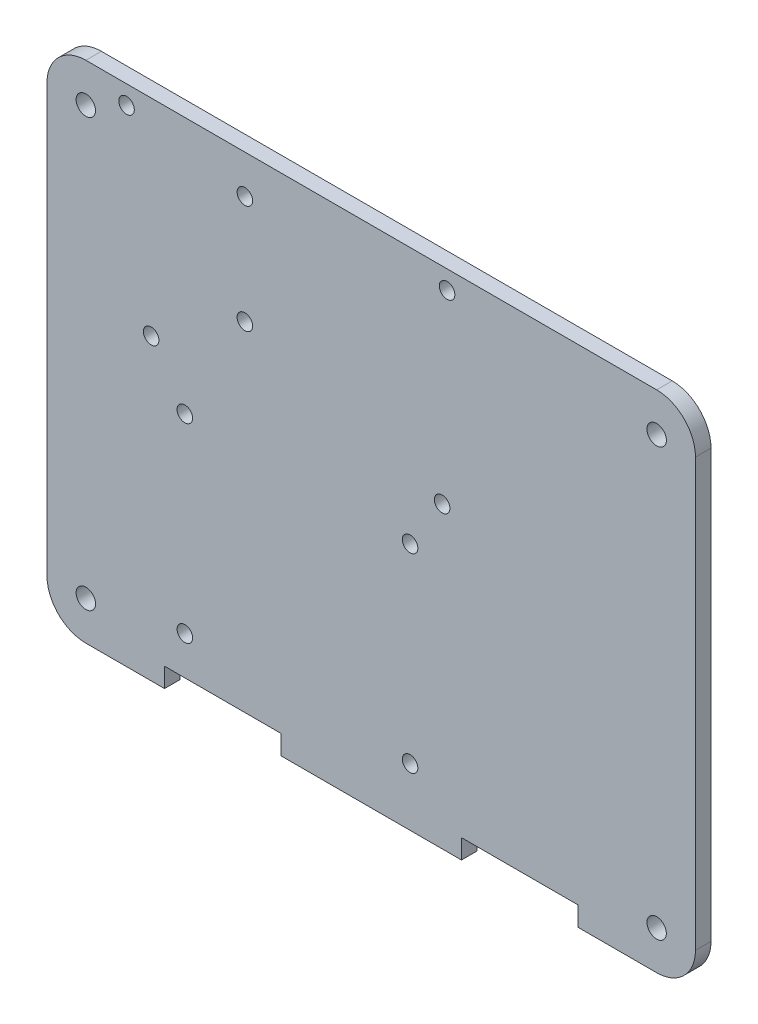
ISO-10303-21;
HEADER;
FILE_DESCRIPTION(('STEP AP214'),'2;1');
FILE_NAME('part.step','',(''),(''),'','','');
FILE_SCHEMA(('AUTOMOTIVE_DESIGN { 1 0 10303 214 1 1 1 1 }'));
ENDSEC;
DATA;
#1=APPLICATION_CONTEXT('core data for automotive mechanical design processes');
#2=APPLICATION_PROTOCOL_DEFINITION('international standard','automotive_design',2000,#1);
#3=PRODUCT_CONTEXT('',#1,'mechanical');
#4=PRODUCT('Part','Part','',(#3));
#5=PRODUCT_RELATED_PRODUCT_CATEGORY('part','',(#4));
#6=PRODUCT_DEFINITION_FORMATION('','',#4);
#7=PRODUCT_DEFINITION_CONTEXT('part definition',#1,'design');
#8=PRODUCT_DEFINITION('design','',#6,#7);
#9=PRODUCT_DEFINITION_SHAPE('','',#8);
#10=(LENGTH_UNIT() NAMED_UNIT(*) SI_UNIT(.MILLI.,.METRE.));
#11=(NAMED_UNIT(*) PLANE_ANGLE_UNIT() SI_UNIT($,.RADIAN.));
#12=(NAMED_UNIT(*) SI_UNIT($,.STERADIAN.) SOLID_ANGLE_UNIT());
#13=UNCERTAINTY_MEASURE_WITH_UNIT(LENGTH_MEASURE(1.E-05),#10,'distance_accuracy_value','');
#14=(GEOMETRIC_REPRESENTATION_CONTEXT(3) GLOBAL_UNCERTAINTY_ASSIGNED_CONTEXT((#13)) GLOBAL_UNIT_ASSIGNED_CONTEXT((#10,
#11,#12)) REPRESENTATION_CONTEXT('',''));
#15=CARTESIAN_POINT('',(0.,0.,0.));
#16=DIRECTION('',(0.,0.,1.));
#17=DIRECTION('',(1.,0.,0.));
#18=AXIS2_PLACEMENT_3D('',#15,#16,#17);
#19=CARTESIAN_POINT('',(-83.5,-65.,4.));
#20=DIRECTION('',(0.,1.,0.));
#21=DIRECTION('',(0.,0.,1.));
#22=AXIS2_PLACEMENT_3D('',#19,#20,#21);
#23=PLANE('',#22);
#24=DIRECTION('',(1.,0.,0.));
#25=VECTOR('',#24,1.);
#26=CARTESIAN_POINT('',(-83.5,-65.,0.));
#27=LINE('',#26,#25);
#28=CARTESIAN_POINT('',(-73.5,-65.,0.));
#29=VERTEX_POINT('',#28);
#30=CARTESIAN_POINT('',(-53.2337974141173,-65.,0.));
#31=VERTEX_POINT('',#30);
#32=EDGE_CURVE('E165',#29,#31,#27,.T.);
#33=ORIENTED_EDGE('',*,*,#32,.T.);
#34=DIRECTION('',(0.,0.,1.));
#35=VECTOR('',#34,1.);
#36=CARTESIAN_POINT('',(-53.2337974141173,-65.,-6.));
#37=LINE('',#36,#35);
#38=CARTESIAN_POINT('',(-53.2337974141173,-65.,4.));
#39=VERTEX_POINT('',#38);
#40=EDGE_CURVE('E148',#31,#39,#37,.T.);
#41=ORIENTED_EDGE('',*,*,#40,.T.);
#42=DIRECTION('',(1.,0.,0.));
#43=VECTOR('',#42,1.);
#44=CARTESIAN_POINT('',(-83.5,-65.,4.));
#45=LINE('',#44,#43);
#46=CARTESIAN_POINT('',(-73.5,-65.,4.));
#47=VERTEX_POINT('',#46);
#48=EDGE_CURVE('E162',#47,#39,#45,.T.);
#49=ORIENTED_EDGE('',*,*,#48,.F.);
#50=DIRECTION('',(0.,0.,-1.));
#51=VECTOR('',#50,1.);
#52=CARTESIAN_POINT('',(-73.5,-65.,4.));
#53=LINE('',#52,#51);
#54=EDGE_CURVE('E174',#47,#29,#53,.T.);
#55=ORIENTED_EDGE('',*,*,#54,.T.);
#56=EDGE_LOOP('',(#33,#41,#49,#55));
#57=FACE_BOUND('',#56,.T.);
#58=ADVANCED_FACE('F33',(#57),#23,.F.);
#59=CARTESIAN_POINT('',(53.2337974141174,-65.,4.));
#60=VERTEX_POINT('',#59);
#61=CARTESIAN_POINT('',(73.5,-65.,4.));
#62=VERTEX_POINT('',#61);
#63=EDGE_CURVE('E177',#60,#62,#45,.T.);
#64=ORIENTED_EDGE('',*,*,#63,.F.);
#65=DIRECTION('',(0.,0.,1.));
#66=VECTOR('',#65,1.);
#67=CARTESIAN_POINT('',(53.2337974141174,-65.,-6.));
#68=LINE('',#67,#66);
#69=CARTESIAN_POINT('',(53.2337974141174,-65.,0.));
#70=VERTEX_POINT('',#69);
#71=EDGE_CURVE('E156',#70,#60,#68,.T.);
#72=ORIENTED_EDGE('',*,*,#71,.F.);
#73=CARTESIAN_POINT('',(73.5,-65.,0.));
#74=VERTEX_POINT('',#73);
#75=EDGE_CURVE('E425',#70,#74,#27,.T.);
#76=ORIENTED_EDGE('',*,*,#75,.T.);
#77=DIRECTION('',(0.,0.,-1.));
#78=VECTOR('',#77,1.);
#79=CARTESIAN_POINT('',(73.5000000000001,-65.,4.));
#80=LINE('',#79,#78);
#81=EDGE_CURVE('E396',#74,#62,#80,.F.);
#82=ORIENTED_EDGE('',*,*,#81,.T.);
#83=EDGE_LOOP('',(#64,#72,#76,#82));
#84=FACE_BOUND('',#83,.T.);
#85=ADVANCED_FACE('F338',(#84),#23,.F.);
#86=CARTESIAN_POINT('',(83.5,65.,4.));
#87=DIRECTION('',(-1.,0.,0.));
#88=DIRECTION('',(0.,-1.,0.));
#89=AXIS2_PLACEMENT_3D('',#86,#87,#88);
#90=PLANE('',#89);
#91=DIRECTION('',(0.,1.,0.));
#92=VECTOR('',#91,1.);
#93=CARTESIAN_POINT('',(83.5,65.,4.));
#94=LINE('',#93,#92);
#95=CARTESIAN_POINT('',(83.5,-55.,4.));
#96=VERTEX_POINT('',#95);
#97=CARTESIAN_POINT('',(83.5,55.,4.));
#98=VERTEX_POINT('',#97);
#99=EDGE_CURVE('E189',#96,#98,#94,.T.);
#100=ORIENTED_EDGE('',*,*,#99,.F.);
#101=DIRECTION('',(0.,0.,-1.));
#102=VECTOR('',#101,1.);
#103=CARTESIAN_POINT('',(83.5,-55.,4.));
#104=LINE('',#103,#102);
#105=CARTESIAN_POINT('',(83.5,-55.,0.));
#106=VERTEX_POINT('',#105);
#107=EDGE_CURVE('E403',#96,#106,#104,.T.);
#108=ORIENTED_EDGE('',*,*,#107,.T.);
#109=DIRECTION('',(0.,1.,0.));
#110=VECTOR('',#109,1.);
#111=CARTESIAN_POINT('',(83.5,65.,0.));
#112=LINE('',#111,#110);
#113=CARTESIAN_POINT('',(83.5,55.,0.));
#114=VERTEX_POINT('',#113);
#115=EDGE_CURVE('E381',#106,#114,#112,.T.);
#116=ORIENTED_EDGE('',*,*,#115,.T.);
#117=DIRECTION('',(0.,0.,-1.));
#118=VECTOR('',#117,1.);
#119=CARTESIAN_POINT('',(83.5,55.,4.));
#120=LINE('',#119,#118);
#121=EDGE_CURVE('E406',#114,#98,#120,.F.);
#122=ORIENTED_EDGE('',*,*,#121,.T.);
#123=EDGE_LOOP('',(#100,#108,#116,#122));
#124=FACE_BOUND('',#123,.T.);
#125=ADVANCED_FACE('F343',(#124),#90,.F.);
#126=CARTESIAN_POINT('',(-83.5,65.,4.));
#127=DIRECTION('',(0.,-1.,0.));
#128=DIRECTION('',(0.,0.,-1.));
#129=AXIS2_PLACEMENT_3D('',#126,#127,#128);
#130=PLANE('',#129);
#131=DIRECTION('',(-1.,0.,0.));
#132=VECTOR('',#131,1.);
#133=CARTESIAN_POINT('',(-83.5,65.,4.));
#134=LINE('',#133,#132);
#135=CARTESIAN_POINT('',(73.5,65.,4.));
#136=VERTEX_POINT('',#135);
#137=CARTESIAN_POINT('',(-73.5,65.,4.));
#138=VERTEX_POINT('',#137);
#139=EDGE_CURVE('E187',#136,#138,#134,.T.);
#140=ORIENTED_EDGE('',*,*,#139,.F.);
#141=DIRECTION('',(0.,0.,-1.));
#142=VECTOR('',#141,1.);
#143=CARTESIAN_POINT('',(73.5,65.,4.));
#144=LINE('',#143,#142);
#145=CARTESIAN_POINT('',(73.5,65.,0.));
#146=VERTEX_POINT('',#145);
#147=EDGE_CURVE('E377',#136,#146,#144,.T.);
#148=ORIENTED_EDGE('',*,*,#147,.T.);
#149=DIRECTION('',(-1.,0.,0.));
#150=VECTOR('',#149,1.);
#151=CARTESIAN_POINT('',(-83.5,65.,0.));
#152=LINE('',#151,#150);
#153=CARTESIAN_POINT('',(-73.5,65.,0.));
#154=VERTEX_POINT('',#153);
#155=EDGE_CURVE('E429',#146,#154,#152,.T.);
#156=ORIENTED_EDGE('',*,*,#155,.T.);
#157=DIRECTION('',(0.,0.,-1.));
#158=VECTOR('',#157,1.);
#159=CARTESIAN_POINT('',(-73.5,65.,4.));
#160=LINE('',#159,#158);
#161=EDGE_CURVE('E408',#154,#138,#160,.F.);
#162=ORIENTED_EDGE('',*,*,#161,.T.);
#163=EDGE_LOOP('',(#140,#148,#156,#162));
#164=FACE_BOUND('',#163,.T.);
#165=ADVANCED_FACE('F353',(#164),#130,.F.);
#166=CARTESIAN_POINT('',(-83.5,65.,4.));
#167=DIRECTION('',(1.,0.,0.));
#168=DIRECTION('',(0.,1.,0.));
#169=AXIS2_PLACEMENT_3D('',#166,#167,#168);
#170=PLANE('',#169);
#171=DIRECTION('',(0.,-1.,0.));
#172=VECTOR('',#171,1.);
#173=CARTESIAN_POINT('',(-83.5,65.,0.));
#174=LINE('',#173,#172);
#175=CARTESIAN_POINT('',(-83.5,55.,0.));
#176=VERTEX_POINT('',#175);
#177=CARTESIAN_POINT('',(-83.5,-55.,0.));
#178=VERTEX_POINT('',#177);
#179=EDGE_CURVE('E426',#176,#178,#174,.T.);
#180=ORIENTED_EDGE('',*,*,#179,.T.);
#181=DIRECTION('',(0.,0.,-1.));
#182=VECTOR('',#181,1.);
#183=CARTESIAN_POINT('',(-83.5,-55.,4.));
#184=LINE('',#183,#182);
#185=CARTESIAN_POINT('',(-83.5,-55.,4.));
#186=VERTEX_POINT('',#185);
#187=EDGE_CURVE('E414',#178,#186,#184,.F.);
#188=ORIENTED_EDGE('',*,*,#187,.T.);
#189=DIRECTION('',(0.,-1.,0.));
#190=VECTOR('',#189,1.);
#191=CARTESIAN_POINT('',(-83.5,65.,4.));
#192=LINE('',#191,#190);
#193=CARTESIAN_POINT('',(-83.5,55.,4.));
#194=VERTEX_POINT('',#193);
#195=EDGE_CURVE('E183',#194,#186,#192,.T.);
#196=ORIENTED_EDGE('',*,*,#195,.F.);
#197=DIRECTION('',(0.,0.,-1.));
#198=VECTOR('',#197,1.);
#199=CARTESIAN_POINT('',(-83.5,55.,4.));
#200=LINE('',#199,#198);
#201=EDGE_CURVE('E416',#194,#176,#200,.T.);
#202=ORIENTED_EDGE('',*,*,#201,.T.);
#203=EDGE_LOOP('',(#180,#188,#196,#202));
#204=FACE_BOUND('',#203,.T.);
#205=ADVANCED_FACE('F348',(#204),#170,.F.);
#206=CARTESIAN_POINT('',(-23.2337974141174,-65.,4.));
#207=VERTEX_POINT('',#206);
#208=CARTESIAN_POINT('',(23.2337974141174,-65.,4.));
#209=VERTEX_POINT('',#208);
#210=EDGE_CURVE('E175',#207,#209,#45,.T.);
#211=ORIENTED_EDGE('',*,*,#210,.F.);
#212=DIRECTION('',(0.,0.,1.));
#213=VECTOR('',#212,1.);
#214=CARTESIAN_POINT('',(-23.2337974141174,-65.,-6.));
#215=LINE('',#214,#213);
#216=CARTESIAN_POINT('',(-23.2337974141174,-65.,0.));
#217=VERTEX_POINT('',#216);
#218=EDGE_CURVE('E166',#217,#207,#215,.T.);
#219=ORIENTED_EDGE('',*,*,#218,.F.);
#220=CARTESIAN_POINT('',(23.2337974141174,-65.,0.));
#221=VERTEX_POINT('',#220);
#222=EDGE_CURVE('E424',#217,#221,#27,.T.);
#223=ORIENTED_EDGE('',*,*,#222,.T.);
#224=DIRECTION('',(0.,0.,1.));
#225=VECTOR('',#224,1.);
#226=CARTESIAN_POINT('',(23.2337974141174,-65.,-6.));
#227=LINE('',#226,#225);
#228=EDGE_CURVE('E211',#221,#209,#227,.T.);
#229=ORIENTED_EDGE('',*,*,#228,.T.);
#230=EDGE_LOOP('',(#211,#219,#223,#229));
#231=FACE_BOUND('',#230,.T.);
#232=ADVANCED_FACE('F299',(#231),#23,.F.);
#233=CARTESIAN_POINT('',(0.,0.,4.));
#234=DIRECTION('',(0.,0.,1.));
#235=DIRECTION('',(1.,0.,0.));
#236=AXIS2_PLACEMENT_3D('',#233,#234,#235);
#237=PLANE('',#236);
#238=CARTESIAN_POINT('',(-63.0199999999999,60.1901793205921,4.));
#239=DIRECTION('',(0.,0.,1.));
#240=DIRECTION('',(1.,0.,0.));
#241=AXIS2_PLACEMENT_3D('',#238,#239,#240);
#242=CIRCLE('',#241,2.);
#243=CARTESIAN_POINT('',(-61.0199999999999,60.1901793205921,4.));
#244=VERTEX_POINT('',#243);
#245=EDGE_CURVE('E281',#244,#244,#242,.T.);
#246=ORIENTED_EDGE('',*,*,#245,.F.);
#247=EDGE_LOOP('',(#246));
#248=FACE_BOUND('',#247,.T.);
#249=CARTESIAN_POINT('',(-32.5399999999999,55.1101793205921,4.));
#250=DIRECTION('',(0.,0.,1.));
#251=DIRECTION('',(1.,0.,0.));
#252=AXIS2_PLACEMENT_3D('',#249,#250,#251);
#253=CIRCLE('',#252,2.);
#254=CARTESIAN_POINT('',(-30.5399999999999,55.1101793205921,4.));
#255=VERTEX_POINT('',#254);
#256=EDGE_CURVE('E275',#255,#255,#253,.T.);
#257=ORIENTED_EDGE('',*,*,#256,.F.);
#258=EDGE_LOOP('',(#257));
#259=FACE_BOUND('',#258,.T.);
#260=CARTESIAN_POINT('',(-32.5399999999999,27.1701793205921,4.));
#261=DIRECTION('',(0.,0.,1.));
#262=DIRECTION('',(1.,0.,0.));
#263=AXIS2_PLACEMENT_3D('',#260,#261,#262);
#264=CIRCLE('',#263,2.);
#265=CARTESIAN_POINT('',(-30.5399999999999,27.1701793205921,4.));
#266=VERTEX_POINT('',#265);
#267=EDGE_CURVE('E269',#266,#266,#264,.T.);
#268=ORIENTED_EDGE('',*,*,#267,.F.);
#269=EDGE_LOOP('',(#268));
#270=FACE_BOUND('',#269,.T.);
#271=CARTESIAN_POINT('',(19.5300000000001,60.1901793205921,4.));
#272=DIRECTION('',(0.,0.,1.));
#273=DIRECTION('',(1.,0.,0.));
#274=AXIS2_PLACEMENT_3D('',#271,#272,#273);
#275=CIRCLE('',#274,2.);
#276=CARTESIAN_POINT('',(21.5300000000001,60.1901793205921,4.));
#277=VERTEX_POINT('',#276);
#278=EDGE_CURVE('E263',#277,#277,#275,.T.);
#279=ORIENTED_EDGE('',*,*,#278,.F.);
#280=EDGE_LOOP('',(#279));
#281=FACE_BOUND('',#280,.T.);
#282=CARTESIAN_POINT('',(18.2600000000001,11.9301793205921,4.));
#283=DIRECTION('',(0.,0.,1.));
#284=DIRECTION('',(1.,0.,0.));
#285=AXIS2_PLACEMENT_3D('',#282,#283,#284);
#286=CIRCLE('',#285,2.);
#287=CARTESIAN_POINT('',(20.2600000000001,11.9301793205921,4.));
#288=VERTEX_POINT('',#287);
#289=EDGE_CURVE('E257',#288,#288,#286,.T.);
#290=ORIENTED_EDGE('',*,*,#289,.F.);
#291=EDGE_LOOP('',(#290));
#292=FACE_BOUND('',#291,.T.);
#293=CARTESIAN_POINT('',(-56.6699999999999,11.9301793205921,4.));
#294=DIRECTION('',(0.,0.,1.));
#295=DIRECTION('',(1.,0.,0.));
#296=AXIS2_PLACEMENT_3D('',#293,#294,#295);
#297=CIRCLE('',#296,2.);
#298=CARTESIAN_POINT('',(-54.6699999999999,11.9301793205921,4.));
#299=VERTEX_POINT('',#298);
#300=EDGE_CURVE('E251',#299,#299,#297,.T.);
#301=ORIENTED_EDGE('',*,*,#300,.F.);
#302=EDGE_LOOP('',(#301));
#303=FACE_BOUND('',#302,.T.);
#304=CARTESIAN_POINT('',(10.,-1.10624537225093,4.));
#305=DIRECTION('',(0.,0.,1.));
#306=DIRECTION('',(1.,0.,0.));
#307=AXIS2_PLACEMENT_3D('',#304,#305,#306);
#308=CIRCLE('',#307,2.);
#309=CARTESIAN_POINT('',(12.,-1.10624537225093,4.));
#310=VERTEX_POINT('',#309);
#311=EDGE_CURVE('E233',#310,#310,#308,.T.);
#312=ORIENTED_EDGE('',*,*,#311,.F.);
#313=EDGE_LOOP('',(#312));
#314=FACE_BOUND('',#313,.T.);
#315=CARTESIAN_POINT('',(-48.,-50.106245372251,4.));
#316=DIRECTION('',(0.,0.,1.));
#317=DIRECTION('',(1.,0.,0.));
#318=AXIS2_PLACEMENT_3D('',#315,#316,#317);
#319=CIRCLE('',#318,2.);
#320=CARTESIAN_POINT('',(-46.,-50.106245372251,4.));
#321=VERTEX_POINT('',#320);
#322=EDGE_CURVE('E240',#321,#321,#319,.T.);
#323=ORIENTED_EDGE('',*,*,#322,.F.);
#324=EDGE_LOOP('',(#323));
#325=FACE_BOUND('',#324,.T.);
#326=CARTESIAN_POINT('',(10.,-50.1062453722509,4.));
#327=DIRECTION('',(0.,0.,1.));
#328=DIRECTION('',(1.,0.,0.));
#329=AXIS2_PLACEMENT_3D('',#326,#327,#328);
#330=CIRCLE('',#329,2.);
#331=CARTESIAN_POINT('',(12.,-50.1062453722509,4.));
#332=VERTEX_POINT('',#331);
#333=EDGE_CURVE('E246',#332,#332,#330,.T.);
#334=ORIENTED_EDGE('',*,*,#333,.F.);
#335=EDGE_LOOP('',(#334));
#336=FACE_BOUND('',#335,.T.);
#337=CARTESIAN_POINT('',(-48.,-1.10624537225095,4.));
#338=DIRECTION('',(0.,0.,1.));
#339=DIRECTION('',(1.,0.,0.));
#340=AXIS2_PLACEMENT_3D('',#337,#338,#339);
#341=CIRCLE('',#340,2.);
#342=CARTESIAN_POINT('',(-46.,-1.10624537225095,4.));
#343=VERTEX_POINT('',#342);
#344=EDGE_CURVE('E227',#343,#343,#341,.T.);
#345=ORIENTED_EDGE('',*,*,#344,.F.);
#346=EDGE_LOOP('',(#345));
#347=FACE_BOUND('',#346,.T.);
#348=DIRECTION('',(0.,-1.,0.));
#349=VECTOR('',#348,1.);
#350=CARTESIAN_POINT('',(-53.2337974141173,-65.,4.));
#351=LINE('',#350,#349);
#352=CARTESIAN_POINT('',(-53.2337974141173,-60.,4.));
#353=VERTEX_POINT('',#352);
#354=EDGE_CURVE('E145',#353,#39,#351,.T.);
#355=ORIENTED_EDGE('',*,*,#354,.F.);
#356=DIRECTION('',(-1.,0.,0.));
#357=VECTOR('',#356,1.);
#358=CARTESIAN_POINT('',(-53.2337974141173,-60.,4.));
#359=LINE('',#358,#357);
#360=CARTESIAN_POINT('',(-23.2337974141174,-60.,4.));
#361=VERTEX_POINT('',#360);
#362=EDGE_CURVE('E167',#361,#353,#359,.T.);
#363=ORIENTED_EDGE('',*,*,#362,.F.);
#364=DIRECTION('',(0.,1.,0.));
#365=VECTOR('',#364,1.);
#366=CARTESIAN_POINT('',(-23.2337974141174,-65.,4.));
#367=LINE('',#366,#365);
#368=EDGE_CURVE('E155',#207,#361,#367,.T.);
#369=ORIENTED_EDGE('',*,*,#368,.F.);
#370=ORIENTED_EDGE('',*,*,#210,.T.);
#371=DIRECTION('',(0.,-1.,0.));
#372=VECTOR('',#371,1.);
#373=CARTESIAN_POINT('',(23.2337974141174,-65.,4.));
#374=LINE('',#373,#372);
#375=CARTESIAN_POINT('',(23.2337974141174,-60.,4.));
#376=VERTEX_POINT('',#375);
#377=EDGE_CURVE('E209',#376,#209,#374,.T.);
#378=ORIENTED_EDGE('',*,*,#377,.F.);
#379=DIRECTION('',(-1.,0.,0.));
#380=VECTOR('',#379,1.);
#381=CARTESIAN_POINT('',(53.2337974141174,-60.,4.));
#382=LINE('',#381,#380);
#383=CARTESIAN_POINT('',(53.2337974141174,-60.,4.));
#384=VERTEX_POINT('',#383);
#385=EDGE_CURVE('E216',#384,#376,#382,.T.);
#386=ORIENTED_EDGE('',*,*,#385,.F.);
#387=DIRECTION('',(0.,1.,0.));
#388=VECTOR('',#387,1.);
#389=CARTESIAN_POINT('',(53.2337974141174,-65.,4.));
#390=LINE('',#389,#388);
#391=EDGE_CURVE('E218',#60,#384,#390,.T.);
#392=ORIENTED_EDGE('',*,*,#391,.F.);
#393=ORIENTED_EDGE('',*,*,#63,.T.);
#394=CARTESIAN_POINT('',(73.5000000000001,-55.,4.));
#395=DIRECTION('',(0.,0.,1.));
#396=DIRECTION('',(1.,0.,0.));
#397=AXIS2_PLACEMENT_3D('',#394,#395,#396);
#398=CIRCLE('',#397,10.);
#399=EDGE_CURVE('E392',#62,#96,#398,.T.);
#400=ORIENTED_EDGE('',*,*,#399,.T.);
#401=ORIENTED_EDGE('',*,*,#99,.T.);
#402=CARTESIAN_POINT('',(73.5,55.,4.));
#403=DIRECTION('',(0.,0.,1.));
#404=DIRECTION('',(1.,0.,0.));
#405=AXIS2_PLACEMENT_3D('',#402,#403,#404);
#406=CIRCLE('',#405,10.);
#407=EDGE_CURVE('E394',#98,#136,#406,.T.);
#408=ORIENTED_EDGE('',*,*,#407,.T.);
#409=ORIENTED_EDGE('',*,*,#139,.T.);
#410=CARTESIAN_POINT('',(-73.5,55.,4.));
#411=DIRECTION('',(0.,0.,1.));
#412=DIRECTION('',(1.,0.,0.));
#413=AXIS2_PLACEMENT_3D('',#410,#411,#412);
#414=CIRCLE('',#413,10.);
#415=EDGE_CURVE('E412',#138,#194,#414,.T.);
#416=ORIENTED_EDGE('',*,*,#415,.T.);
#417=ORIENTED_EDGE('',*,*,#195,.T.);
#418=CARTESIAN_POINT('',(-73.5,-55.,4.));
#419=DIRECTION('',(0.,0.,1.));
#420=DIRECTION('',(1.,0.,0.));
#421=AXIS2_PLACEMENT_3D('',#418,#419,#420);
#422=CIRCLE('',#421,10.);
#423=EDGE_CURVE('E173',#186,#47,#422,.T.);
#424=ORIENTED_EDGE('',*,*,#423,.T.);
#425=ORIENTED_EDGE('',*,*,#48,.T.);
#426=EDGE_LOOP('',(#355,#363,#369,#370,#378,#386,#392,#393,#400,#401,#408,#409,#416,#417,#424,#425));
#427=FACE_BOUND('',#426,.T.);
#428=CARTESIAN_POINT('',(73.5,55.,4.));
#429=DIRECTION('',(0.,0.,1.));
#430=DIRECTION('',(1.,0.,0.));
#431=AXIS2_PLACEMENT_3D('',#428,#429,#430);
#432=CIRCLE('',#431,2.5);
#433=CARTESIAN_POINT('',(76.,55.,4.));
#434=VERTEX_POINT('',#433);
#435=EDGE_CURVE('E198',#434,#434,#432,.T.);
#436=ORIENTED_EDGE('',*,*,#435,.F.);
#437=EDGE_LOOP('',(#436));
#438=FACE_BOUND('',#437,.T.);
#439=CARTESIAN_POINT('',(-73.5,-55.,4.));
#440=DIRECTION('',(0.,0.,1.));
#441=DIRECTION('',(1.,0.,0.));
#442=AXIS2_PLACEMENT_3D('',#439,#440,#441);
#443=CIRCLE('',#442,2.50000000000001);
#444=CARTESIAN_POINT('',(-71.,-55.,4.));
#445=VERTEX_POINT('',#444);
#446=EDGE_CURVE('E199',#445,#445,#443,.T.);
#447=ORIENTED_EDGE('',*,*,#446,.F.);
#448=EDGE_LOOP('',(#447));
#449=FACE_BOUND('',#448,.T.);
#450=CARTESIAN_POINT('',(73.5000000000001,-55.,4.));
#451=DIRECTION('',(0.,0.,1.));
#452=DIRECTION('',(1.,0.,0.));
#453=AXIS2_PLACEMENT_3D('',#450,#451,#452);
#454=CIRCLE('',#453,2.50000000000001);
#455=CARTESIAN_POINT('',(76.0000000000001,-55.,4.));
#456=VERTEX_POINT('',#455);
#457=EDGE_CURVE('E202',#456,#456,#454,.T.);
#458=ORIENTED_EDGE('',*,*,#457,.F.);
#459=EDGE_LOOP('',(#458));
#460=FACE_BOUND('',#459,.T.);
#461=CARTESIAN_POINT('',(-73.5,55.,4.));
#462=DIRECTION('',(0.,0.,1.));
#463=DIRECTION('',(1.,0.,0.));
#464=AXIS2_PLACEMENT_3D('',#461,#462,#463);
#465=CIRCLE('',#464,2.50000000000001);
#466=CARTESIAN_POINT('',(-71.,55.,4.));
#467=VERTEX_POINT('',#466);
#468=EDGE_CURVE('E194',#467,#467,#465,.T.);
#469=ORIENTED_EDGE('',*,*,#468,.F.);
#470=EDGE_LOOP('',(#469));
#471=FACE_BOUND('',#470,.T.);
#472=ADVANCED_FACE('F169',(#248,#259,#270,#281,#292,#303,#314,#325,#336,#347,#427,#438,#449,
#460,#471),#237,.T.);
#473=CARTESIAN_POINT('',(0.,0.,0.));
#474=DIRECTION('',(0.,0.,1.));
#475=DIRECTION('',(1.,0.,0.));
#476=AXIS2_PLACEMENT_3D('',#473,#474,#475);
#477=PLANE('',#476);
#478=CARTESIAN_POINT('',(-63.0199999999999,60.1901793205921,0.));
#479=DIRECTION('',(0.,0.,1.));
#480=DIRECTION('',(1.,0.,0.));
#481=AXIS2_PLACEMENT_3D('',#478,#479,#480);
#482=CIRCLE('',#481,2.);
#483=CARTESIAN_POINT('',(-61.0199999999999,60.1901793205921,0.));
#484=VERTEX_POINT('',#483);
#485=EDGE_CURVE('E237',#484,#484,#482,.T.);
#486=ORIENTED_EDGE('',*,*,#485,.T.);
#487=EDGE_LOOP('',(#486));
#488=FACE_BOUND('',#487,.T.);
#489=CARTESIAN_POINT('',(-32.5399999999999,55.1101793205921,0.));
#490=DIRECTION('',(0.,0.,1.));
#491=DIRECTION('',(1.,0.,0.));
#492=AXIS2_PLACEMENT_3D('',#489,#490,#491);
#493=CIRCLE('',#492,2.);
#494=CARTESIAN_POINT('',(-30.5399999999999,55.1101793205921,0.));
#495=VERTEX_POINT('',#494);
#496=EDGE_CURVE('E278',#495,#495,#493,.T.);
#497=ORIENTED_EDGE('',*,*,#496,.T.);
#498=EDGE_LOOP('',(#497));
#499=FACE_BOUND('',#498,.T.);
#500=CARTESIAN_POINT('',(-32.5399999999999,27.1701793205921,0.));
#501=DIRECTION('',(0.,0.,1.));
#502=DIRECTION('',(1.,0.,0.));
#503=AXIS2_PLACEMENT_3D('',#500,#501,#502);
#504=CIRCLE('',#503,2.);
#505=CARTESIAN_POINT('',(-30.5399999999999,27.1701793205921,0.));
#506=VERTEX_POINT('',#505);
#507=EDGE_CURVE('E272',#506,#506,#504,.T.);
#508=ORIENTED_EDGE('',*,*,#507,.T.);
#509=EDGE_LOOP('',(#508));
#510=FACE_BOUND('',#509,.T.);
#511=CARTESIAN_POINT('',(19.5300000000001,60.1901793205921,0.));
#512=DIRECTION('',(0.,0.,1.));
#513=DIRECTION('',(1.,0.,0.));
#514=AXIS2_PLACEMENT_3D('',#511,#512,#513);
#515=CIRCLE('',#514,2.);
#516=CARTESIAN_POINT('',(21.5300000000001,60.1901793205921,0.));
#517=VERTEX_POINT('',#516);
#518=EDGE_CURVE('E266',#517,#517,#515,.T.);
#519=ORIENTED_EDGE('',*,*,#518,.T.);
#520=EDGE_LOOP('',(#519));
#521=FACE_BOUND('',#520,.T.);
#522=CARTESIAN_POINT('',(18.2600000000001,11.9301793205921,0.));
#523=DIRECTION('',(0.,0.,1.));
#524=DIRECTION('',(1.,0.,0.));
#525=AXIS2_PLACEMENT_3D('',#522,#523,#524);
#526=CIRCLE('',#525,2.);
#527=CARTESIAN_POINT('',(20.2600000000001,11.9301793205921,0.));
#528=VERTEX_POINT('',#527);
#529=EDGE_CURVE('E260',#528,#528,#526,.T.);
#530=ORIENTED_EDGE('',*,*,#529,.T.);
#531=EDGE_LOOP('',(#530));
#532=FACE_BOUND('',#531,.T.);
#533=CARTESIAN_POINT('',(-56.6699999999999,11.9301793205921,0.));
#534=DIRECTION('',(0.,0.,1.));
#535=DIRECTION('',(1.,0.,0.));
#536=AXIS2_PLACEMENT_3D('',#533,#534,#535);
#537=CIRCLE('',#536,2.);
#538=CARTESIAN_POINT('',(-54.6699999999999,11.9301793205921,0.));
#539=VERTEX_POINT('',#538);
#540=EDGE_CURVE('E254',#539,#539,#537,.T.);
#541=ORIENTED_EDGE('',*,*,#540,.T.);
#542=EDGE_LOOP('',(#541));
#543=FACE_BOUND('',#542,.T.);
#544=CARTESIAN_POINT('',(10.,-1.10624537225093,0.));
#545=DIRECTION('',(0.,0.,1.));
#546=DIRECTION('',(1.,0.,0.));
#547=AXIS2_PLACEMENT_3D('',#544,#545,#546);
#548=CIRCLE('',#547,2.);
#549=CARTESIAN_POINT('',(12.,-1.10624537225093,0.));
#550=VERTEX_POINT('',#549);
#551=EDGE_CURVE('E236',#550,#550,#548,.T.);
#552=ORIENTED_EDGE('',*,*,#551,.T.);
#553=EDGE_LOOP('',(#552));
#554=FACE_BOUND('',#553,.T.);
#555=CARTESIAN_POINT('',(-48.,-50.106245372251,0.));
#556=DIRECTION('',(0.,0.,1.));
#557=DIRECTION('',(1.,0.,0.));
#558=AXIS2_PLACEMENT_3D('',#555,#556,#557);
#559=CIRCLE('',#558,2.);
#560=CARTESIAN_POINT('',(-46.,-50.106245372251,0.));
#561=VERTEX_POINT('',#560);
#562=EDGE_CURVE('E243',#561,#561,#559,.T.);
#563=ORIENTED_EDGE('',*,*,#562,.T.);
#564=EDGE_LOOP('',(#563));
#565=FACE_BOUND('',#564,.T.);
#566=CARTESIAN_POINT('',(10.,-50.1062453722509,0.));
#567=DIRECTION('',(0.,0.,1.));
#568=DIRECTION('',(1.,0.,0.));
#569=AXIS2_PLACEMENT_3D('',#566,#567,#568);
#570=CIRCLE('',#569,2.);
#571=CARTESIAN_POINT('',(12.,-50.1062453722509,0.));
#572=VERTEX_POINT('',#571);
#573=EDGE_CURVE('E230',#572,#572,#570,.T.);
#574=ORIENTED_EDGE('',*,*,#573,.T.);
#575=EDGE_LOOP('',(#574));
#576=FACE_BOUND('',#575,.T.);
#577=CARTESIAN_POINT('',(-48.,-1.10624537225095,0.));
#578=DIRECTION('',(0.,0.,1.));
#579=DIRECTION('',(1.,0.,0.));
#580=AXIS2_PLACEMENT_3D('',#577,#578,#579);
#581=CIRCLE('',#580,2.);
#582=CARTESIAN_POINT('',(-46.,-1.10624537225095,0.));
#583=VERTEX_POINT('',#582);
#584=EDGE_CURVE('E220',#583,#583,#581,.T.);
#585=ORIENTED_EDGE('',*,*,#584,.T.);
#586=EDGE_LOOP('',(#585));
#587=FACE_BOUND('',#586,.T.);
#588=DIRECTION('',(-1.,0.,0.));
#589=VECTOR('',#588,1.);
#590=CARTESIAN_POINT('',(0.,-60.,0.));
#591=LINE('',#590,#589);
#592=CARTESIAN_POINT('',(-23.2337974141174,-60.,0.));
#593=VERTEX_POINT('',#592);
#594=CARTESIAN_POINT('',(-53.2337974141173,-60.,0.));
#595=VERTEX_POINT('',#594);
#596=EDGE_CURVE('E41',#593,#595,#591,.T.);
#597=ORIENTED_EDGE('',*,*,#596,.T.);
#598=DIRECTION('',(0.,-1.,0.));
#599=VECTOR('',#598,1.);
#600=CARTESIAN_POINT('',(-53.2337974141173,0.,0.));
#601=LINE('',#600,#599);
#602=EDGE_CURVE('E11',#595,#31,#601,.T.);
#603=ORIENTED_EDGE('',*,*,#602,.T.);
#604=ORIENTED_EDGE('',*,*,#32,.F.);
#605=CARTESIAN_POINT('',(-73.5,-55.,0.));
#606=DIRECTION('',(0.,0.,1.));
#607=DIRECTION('',(1.,0.,0.));
#608=AXIS2_PLACEMENT_3D('',#605,#606,#607);
#609=CIRCLE('',#608,10.);
#610=EDGE_CURVE('E419',#29,#178,#609,.F.);
#611=ORIENTED_EDGE('',*,*,#610,.T.);
#612=ORIENTED_EDGE('',*,*,#179,.F.);
#613=CARTESIAN_POINT('',(-73.5,55.,0.));
#614=DIRECTION('',(0.,0.,1.));
#615=DIRECTION('',(1.,0.,0.));
#616=AXIS2_PLACEMENT_3D('',#613,#614,#615);
#617=CIRCLE('',#616,10.);
#618=EDGE_CURVE('E178',#176,#154,#617,.F.);
#619=ORIENTED_EDGE('',*,*,#618,.T.);
#620=ORIENTED_EDGE('',*,*,#155,.F.);
#621=CARTESIAN_POINT('',(73.5,55.,0.));
#622=DIRECTION('',(0.,0.,1.));
#623=DIRECTION('',(1.,0.,0.));
#624=AXIS2_PLACEMENT_3D('',#621,#622,#623);
#625=CIRCLE('',#624,10.);
#626=EDGE_CURVE('E401',#146,#114,#625,.F.);
#627=ORIENTED_EDGE('',*,*,#626,.T.);
#628=ORIENTED_EDGE('',*,*,#115,.F.);
#629=CARTESIAN_POINT('',(73.5000000000001,-55.,0.));
#630=DIRECTION('',(0.,0.,1.));
#631=DIRECTION('',(1.,0.,0.));
#632=AXIS2_PLACEMENT_3D('',#629,#630,#631);
#633=CIRCLE('',#632,10.);
#634=EDGE_CURVE('E398',#106,#74,#633,.F.);
#635=ORIENTED_EDGE('',*,*,#634,.T.);
#636=ORIENTED_EDGE('',*,*,#75,.F.);
#637=DIRECTION('',(0.,1.,0.));
#638=VECTOR('',#637,1.);
#639=CARTESIAN_POINT('',(53.2337974141174,0.,0.));
#640=LINE('',#639,#638);
#641=CARTESIAN_POINT('',(53.2337974141174,-60.,0.));
#642=VERTEX_POINT('',#641);
#643=EDGE_CURVE('E366',#70,#642,#640,.T.);
#644=ORIENTED_EDGE('',*,*,#643,.T.);
#645=DIRECTION('',(-1.,0.,0.));
#646=VECTOR('',#645,1.);
#647=CARTESIAN_POINT('',(0.,-60.,0.));
#648=LINE('',#647,#646);
#649=CARTESIAN_POINT('',(23.2337974141174,-60.,0.));
#650=VERTEX_POINT('',#649);
#651=EDGE_CURVE('E374',#642,#650,#648,.T.);
#652=ORIENTED_EDGE('',*,*,#651,.T.);
#653=DIRECTION('',(0.,-1.,0.));
#654=VECTOR('',#653,1.);
#655=CARTESIAN_POINT('',(23.2337974141174,0.,0.));
#656=LINE('',#655,#654);
#657=EDGE_CURVE('E369',#650,#221,#656,.T.);
#658=ORIENTED_EDGE('',*,*,#657,.T.);
#659=ORIENTED_EDGE('',*,*,#222,.F.);
#660=DIRECTION('',(0.,1.,0.));
#661=VECTOR('',#660,1.);
#662=CARTESIAN_POINT('',(-23.2337974141174,0.,0.));
#663=LINE('',#662,#661);
#664=EDGE_CURVE('E363',#217,#593,#663,.T.);
#665=ORIENTED_EDGE('',*,*,#664,.T.);
#666=EDGE_LOOP('',(#597,#603,#604,#611,#612,#619,#620,#627,#628,#635,#636,#644,#652,#658,#659,#665));
#667=FACE_BOUND('',#666,.T.);
#668=CARTESIAN_POINT('',(73.5,55.,0.));
#669=DIRECTION('',(0.,0.,1.));
#670=DIRECTION('',(1.,0.,0.));
#671=AXIS2_PLACEMENT_3D('',#668,#669,#670);
#672=CIRCLE('',#671,2.5);
#673=CARTESIAN_POINT('',(76.,55.,0.));
#674=VERTEX_POINT('',#673);
#675=EDGE_CURVE('E378',#674,#674,#672,.T.);
#676=ORIENTED_EDGE('',*,*,#675,.T.);
#677=EDGE_LOOP('',(#676));
#678=FACE_BOUND('',#677,.T.);
#679=CARTESIAN_POINT('',(-73.5,-55.,0.));
#680=DIRECTION('',(0.,0.,1.));
#681=DIRECTION('',(1.,0.,0.));
#682=AXIS2_PLACEMENT_3D('',#679,#680,#681);
#683=CIRCLE('',#682,2.50000000000001);
#684=CARTESIAN_POINT('',(-71.,-55.,0.));
#685=VERTEX_POINT('',#684);
#686=EDGE_CURVE('E382',#685,#685,#683,.T.);
#687=ORIENTED_EDGE('',*,*,#686,.T.);
#688=EDGE_LOOP('',(#687));
#689=FACE_BOUND('',#688,.T.);
#690=CARTESIAN_POINT('',(73.5000000000001,-55.,0.));
#691=DIRECTION('',(0.,0.,1.));
#692=DIRECTION('',(1.,0.,0.));
#693=AXIS2_PLACEMENT_3D('',#690,#691,#692);
#694=CIRCLE('',#693,2.50000000000001);
#695=CARTESIAN_POINT('',(76.0000000000001,-55.,0.));
#696=VERTEX_POINT('',#695);
#697=EDGE_CURVE('E385',#696,#696,#694,.T.);
#698=ORIENTED_EDGE('',*,*,#697,.T.);
#699=EDGE_LOOP('',(#698));
#700=FACE_BOUND('',#699,.T.);
#701=CARTESIAN_POINT('',(-73.5,55.,0.));
#702=DIRECTION('',(0.,0.,1.));
#703=DIRECTION('',(1.,0.,0.));
#704=AXIS2_PLACEMENT_3D('',#701,#702,#703);
#705=CIRCLE('',#704,2.50000000000001);
#706=CARTESIAN_POINT('',(-71.,55.,0.));
#707=VERTEX_POINT('',#706);
#708=EDGE_CURVE('E197',#707,#707,#705,.T.);
#709=ORIENTED_EDGE('',*,*,#708,.T.);
#710=EDGE_LOOP('',(#709));
#711=FACE_BOUND('',#710,.T.);
#712=ADVANCED_FACE('F287',(#488,#499,#510,#521,#532,#543,#554,#565,#576,#587,#667,#678,#689,
#700,#711),#477,.F.);
#713=CARTESIAN_POINT('',(-73.5,-55.,4.));
#714=DIRECTION('',(0.,0.,-1.));
#715=DIRECTION('',(-1.,0.,0.));
#716=AXIS2_PLACEMENT_3D('',#713,#714,#715);
#717=CYLINDRICAL_SURFACE('',#716,10.);
#718=ORIENTED_EDGE('',*,*,#423,.F.);
#719=ORIENTED_EDGE('',*,*,#187,.F.);
#720=ORIENTED_EDGE('',*,*,#610,.F.);
#721=ORIENTED_EDGE('',*,*,#54,.F.);
#722=EDGE_LOOP('',(#718,#719,#720,#721));
#723=FACE_BOUND('',#722,.T.);
#724=ADVANCED_FACE('F450',(#723),#717,.T.);
#725=CARTESIAN_POINT('',(-73.5,55.,4.));
#726=DIRECTION('',(0.,0.,-1.));
#727=DIRECTION('',(-1.,0.,0.));
#728=AXIS2_PLACEMENT_3D('',#725,#726,#727);
#729=CYLINDRICAL_SURFACE('',#728,10.);
#730=ORIENTED_EDGE('',*,*,#415,.F.);
#731=ORIENTED_EDGE('',*,*,#161,.F.);
#732=ORIENTED_EDGE('',*,*,#618,.F.);
#733=ORIENTED_EDGE('',*,*,#201,.F.);
#734=EDGE_LOOP('',(#730,#731,#732,#733));
#735=FACE_BOUND('',#734,.T.);
#736=ADVANCED_FACE('F446',(#735),#729,.T.);
#737=CARTESIAN_POINT('',(73.5000000000001,-55.,4.));
#738=DIRECTION('',(0.,0.,-1.));
#739=DIRECTION('',(-1.,0.,0.));
#740=AXIS2_PLACEMENT_3D('',#737,#738,#739);
#741=CYLINDRICAL_SURFACE('',#740,10.);
#742=ORIENTED_EDGE('',*,*,#399,.F.);
#743=ORIENTED_EDGE('',*,*,#81,.F.);
#744=ORIENTED_EDGE('',*,*,#634,.F.);
#745=ORIENTED_EDGE('',*,*,#107,.F.);
#746=EDGE_LOOP('',(#742,#743,#744,#745));
#747=FACE_BOUND('',#746,.T.);
#748=ADVANCED_FACE('F493',(#747),#741,.T.);
#749=CARTESIAN_POINT('',(73.5,55.,4.));
#750=DIRECTION('',(0.,0.,-1.));
#751=DIRECTION('',(-1.,0.,0.));
#752=AXIS2_PLACEMENT_3D('',#749,#750,#751);
#753=CYLINDRICAL_SURFACE('',#752,10.);
#754=ORIENTED_EDGE('',*,*,#407,.F.);
#755=ORIENTED_EDGE('',*,*,#121,.F.);
#756=ORIENTED_EDGE('',*,*,#626,.F.);
#757=ORIENTED_EDGE('',*,*,#147,.F.);
#758=EDGE_LOOP('',(#754,#755,#756,#757));
#759=FACE_BOUND('',#758,.T.);
#760=ADVANCED_FACE('F35',(#759),#753,.T.);
#761=CARTESIAN_POINT('',(-73.5,55.,-66.));
#762=DIRECTION('',(0.,0.,1.));
#763=DIRECTION('',(1.,0.,0.));
#764=AXIS2_PLACEMENT_3D('',#761,#762,#763);
#765=CYLINDRICAL_SURFACE('',#764,2.50000000000001);
#766=ORIENTED_EDGE('',*,*,#468,.T.);
#767=EDGE_LOOP('',(#766));
#768=FACE_BOUND('',#767,.T.);
#769=ORIENTED_EDGE('',*,*,#708,.F.);
#770=EDGE_LOOP('',(#769));
#771=FACE_BOUND('',#770,.T.);
#772=ADVANCED_FACE('F475',(#768,#771),#765,.F.);
#773=CARTESIAN_POINT('',(73.5000000000001,-55.,-66.));
#774=DIRECTION('',(0.,0.,1.));
#775=DIRECTION('',(1.,0.,0.));
#776=AXIS2_PLACEMENT_3D('',#773,#774,#775);
#777=CYLINDRICAL_SURFACE('',#776,2.50000000000001);
#778=ORIENTED_EDGE('',*,*,#457,.T.);
#779=EDGE_LOOP('',(#778));
#780=FACE_BOUND('',#779,.T.);
#781=ORIENTED_EDGE('',*,*,#697,.F.);
#782=EDGE_LOOP('',(#781));
#783=FACE_BOUND('',#782,.T.);
#784=ADVANCED_FACE('F471',(#780,#783),#777,.F.);
#785=CARTESIAN_POINT('',(-73.5,-55.,-66.));
#786=DIRECTION('',(0.,0.,1.));
#787=DIRECTION('',(1.,0.,0.));
#788=AXIS2_PLACEMENT_3D('',#785,#786,#787);
#789=CYLINDRICAL_SURFACE('',#788,2.50000000000001);
#790=ORIENTED_EDGE('',*,*,#446,.T.);
#791=EDGE_LOOP('',(#790));
#792=FACE_BOUND('',#791,.T.);
#793=ORIENTED_EDGE('',*,*,#686,.F.);
#794=EDGE_LOOP('',(#793));
#795=FACE_BOUND('',#794,.T.);
#796=ADVANCED_FACE('F474',(#792,#795),#789,.F.);
#797=CARTESIAN_POINT('',(73.5,55.,-66.));
#798=DIRECTION('',(0.,0.,1.));
#799=DIRECTION('',(1.,0.,0.));
#800=AXIS2_PLACEMENT_3D('',#797,#798,#799);
#801=CYLINDRICAL_SURFACE('',#800,2.5);
#802=ORIENTED_EDGE('',*,*,#435,.T.);
#803=EDGE_LOOP('',(#802));
#804=FACE_BOUND('',#803,.T.);
#805=ORIENTED_EDGE('',*,*,#675,.F.);
#806=EDGE_LOOP('',(#805));
#807=FACE_BOUND('',#806,.T.);
#808=ADVANCED_FACE('F469',(#804,#807),#801,.F.);
#809=CARTESIAN_POINT('',(53.2337974141174,-65.,-6.));
#810=DIRECTION('',(1.,0.,0.));
#811=DIRECTION('',(0.,0.,-1.));
#812=AXIS2_PLACEMENT_3D('',#809,#810,#811);
#813=PLANE('',#812);
#814=ORIENTED_EDGE('',*,*,#71,.T.);
#815=ORIENTED_EDGE('',*,*,#391,.T.);
#816=DIRECTION('',(0.,0.,1.));
#817=VECTOR('',#816,1.);
#818=CARTESIAN_POINT('',(53.2337974141174,-60.,-6.));
#819=LINE('',#818,#817);
#820=EDGE_CURVE('E207',#642,#384,#819,.T.);
#821=ORIENTED_EDGE('',*,*,#820,.F.);
#822=ORIENTED_EDGE('',*,*,#643,.F.);
#823=EDGE_LOOP('',(#814,#815,#821,#822));
#824=FACE_BOUND('',#823,.T.);
#825=ADVANCED_FACE('F463',(#824),#813,.F.);
#826=CARTESIAN_POINT('',(23.2337974141174,-65.,-6.));
#827=DIRECTION('',(-1.,0.,0.));
#828=DIRECTION('',(0.,0.,1.));
#829=AXIS2_PLACEMENT_3D('',#826,#827,#828);
#830=PLANE('',#829);
#831=DIRECTION('',(0.,0.,1.));
#832=VECTOR('',#831,1.);
#833=CARTESIAN_POINT('',(23.2337974141174,-60.,-6.));
#834=LINE('',#833,#832);
#835=EDGE_CURVE('E56',#650,#376,#834,.T.);
#836=ORIENTED_EDGE('',*,*,#835,.T.);
#837=ORIENTED_EDGE('',*,*,#377,.T.);
#838=ORIENTED_EDGE('',*,*,#228,.F.);
#839=ORIENTED_EDGE('',*,*,#657,.F.);
#840=EDGE_LOOP('',(#836,#837,#838,#839));
#841=FACE_BOUND('',#840,.T.);
#842=ADVANCED_FACE('F460',(#841),#830,.F.);
#843=CARTESIAN_POINT('',(53.2337974141174,-60.,-6.));
#844=DIRECTION('',(0.,1.,0.));
#845=DIRECTION('',(0.,0.,1.));
#846=AXIS2_PLACEMENT_3D('',#843,#844,#845);
#847=PLANE('',#846);
#848=ORIENTED_EDGE('',*,*,#820,.T.);
#849=ORIENTED_EDGE('',*,*,#385,.T.);
#850=ORIENTED_EDGE('',*,*,#835,.F.);
#851=ORIENTED_EDGE('',*,*,#651,.F.);
#852=EDGE_LOOP('',(#848,#849,#850,#851));
#853=FACE_BOUND('',#852,.T.);
#854=ADVANCED_FACE('F457',(#853),#847,.F.);
#855=CARTESIAN_POINT('',(-53.2337974141173,-65.,-6.));
#856=DIRECTION('',(-1.,0.,0.));
#857=DIRECTION('',(0.,0.,1.));
#858=AXIS2_PLACEMENT_3D('',#855,#856,#857);
#859=PLANE('',#858);
#860=DIRECTION('',(0.,0.,1.));
#861=VECTOR('',#860,1.);
#862=CARTESIAN_POINT('',(-53.2337974141173,-60.,-6.));
#863=LINE('',#862,#861);
#864=EDGE_CURVE('E150',#595,#353,#863,.T.);
#865=ORIENTED_EDGE('',*,*,#864,.T.);
#866=ORIENTED_EDGE('',*,*,#354,.T.);
#867=ORIENTED_EDGE('',*,*,#40,.F.);
#868=ORIENTED_EDGE('',*,*,#602,.F.);
#869=EDGE_LOOP('',(#865,#866,#867,#868));
#870=FACE_BOUND('',#869,.T.);
#871=ADVANCED_FACE('F147',(#870),#859,.F.);
#872=CARTESIAN_POINT('',(-53.2337974141173,-60.,-6.));
#873=DIRECTION('',(0.,1.,0.));
#874=DIRECTION('',(0.,0.,1.));
#875=AXIS2_PLACEMENT_3D('',#872,#873,#874);
#876=PLANE('',#875);
#877=DIRECTION('',(0.,0.,1.));
#878=VECTOR('',#877,1.);
#879=CARTESIAN_POINT('',(-23.2337974141174,-60.,-6.));
#880=LINE('',#879,#878);
#881=EDGE_CURVE('E48',#593,#361,#880,.T.);
#882=ORIENTED_EDGE('',*,*,#881,.T.);
#883=ORIENTED_EDGE('',*,*,#362,.T.);
#884=ORIENTED_EDGE('',*,*,#864,.F.);
#885=ORIENTED_EDGE('',*,*,#596,.F.);
#886=EDGE_LOOP('',(#882,#883,#884,#885));
#887=FACE_BOUND('',#886,.T.);
#888=ADVANCED_FACE('F332',(#887),#876,.F.);
#889=CARTESIAN_POINT('',(-23.2337974141174,-65.,-6.));
#890=DIRECTION('',(1.,0.,0.));
#891=DIRECTION('',(0.,0.,-1.));
#892=AXIS2_PLACEMENT_3D('',#889,#890,#891);
#893=PLANE('',#892);
#894=ORIENTED_EDGE('',*,*,#218,.T.);
#895=ORIENTED_EDGE('',*,*,#368,.T.);
#896=ORIENTED_EDGE('',*,*,#881,.F.);
#897=ORIENTED_EDGE('',*,*,#664,.F.);
#898=EDGE_LOOP('',(#894,#895,#896,#897));
#899=FACE_BOUND('',#898,.T.);
#900=ADVANCED_FACE('F322',(#899),#893,.F.);
#901=CARTESIAN_POINT('',(-48.,-1.10624537225095,0.));
#902=DIRECTION('',(0.,0.,1.));
#903=DIRECTION('',(1.,0.,0.));
#904=AXIS2_PLACEMENT_3D('',#901,#902,#903);
#905=CYLINDRICAL_SURFACE('',#904,2.);
#906=ORIENTED_EDGE('',*,*,#584,.F.);
#907=EDGE_LOOP('',(#906));
#908=FACE_BOUND('',#907,.T.);
#909=ORIENTED_EDGE('',*,*,#344,.T.);
#910=EDGE_LOOP('',(#909));
#911=FACE_BOUND('',#910,.T.);
#912=ADVANCED_FACE('F319',(#908,#911),#905,.F.);
#913=CARTESIAN_POINT('',(10.,-50.1062453722509,0.));
#914=DIRECTION('',(0.,0.,1.));
#915=DIRECTION('',(1.,0.,0.));
#916=AXIS2_PLACEMENT_3D('',#913,#914,#915);
#917=CYLINDRICAL_SURFACE('',#916,2.);
#918=ORIENTED_EDGE('',*,*,#573,.F.);
#919=EDGE_LOOP('',(#918));
#920=FACE_BOUND('',#919,.T.);
#921=ORIENTED_EDGE('',*,*,#333,.T.);
#922=EDGE_LOOP('',(#921));
#923=FACE_BOUND('',#922,.T.);
#924=ADVANCED_FACE('F321',(#920,#923),#917,.F.);
#925=CARTESIAN_POINT('',(-48.,-50.106245372251,0.));
#926=DIRECTION('',(0.,0.,1.));
#927=DIRECTION('',(1.,0.,0.));
#928=AXIS2_PLACEMENT_3D('',#925,#926,#927);
#929=CYLINDRICAL_SURFACE('',#928,2.);
#930=ORIENTED_EDGE('',*,*,#562,.F.);
#931=EDGE_LOOP('',(#930));
#932=FACE_BOUND('',#931,.T.);
#933=ORIENTED_EDGE('',*,*,#322,.T.);
#934=EDGE_LOOP('',(#933));
#935=FACE_BOUND('',#934,.T.);
#936=ADVANCED_FACE('F329',(#932,#935),#929,.F.);
#937=CARTESIAN_POINT('',(10.,-1.10624537225093,0.));
#938=DIRECTION('',(0.,0.,1.));
#939=DIRECTION('',(1.,0.,0.));
#940=AXIS2_PLACEMENT_3D('',#937,#938,#939);
#941=CYLINDRICAL_SURFACE('',#940,2.);
#942=ORIENTED_EDGE('',*,*,#551,.F.);
#943=EDGE_LOOP('',(#942));
#944=FACE_BOUND('',#943,.T.);
#945=ORIENTED_EDGE('',*,*,#311,.T.);
#946=EDGE_LOOP('',(#945));
#947=FACE_BOUND('',#946,.T.);
#948=ADVANCED_FACE('F570',(#944,#947),#941,.F.);
#949=CARTESIAN_POINT('',(-56.6699999999999,11.9301793205921,0.));
#950=DIRECTION('',(0.,0.,1.));
#951=DIRECTION('',(1.,0.,0.));
#952=AXIS2_PLACEMENT_3D('',#949,#950,#951);
#953=CYLINDRICAL_SURFACE('',#952,2.);
#954=ORIENTED_EDGE('',*,*,#540,.F.);
#955=EDGE_LOOP('',(#954));
#956=FACE_BOUND('',#955,.T.);
#957=ORIENTED_EDGE('',*,*,#300,.T.);
#958=EDGE_LOOP('',(#957));
#959=FACE_BOUND('',#958,.T.);
#960=ADVANCED_FACE('F580',(#956,#959),#953,.F.);
#961=CARTESIAN_POINT('',(18.2600000000001,11.9301793205921,0.));
#962=DIRECTION('',(0.,0.,1.));
#963=DIRECTION('',(1.,0.,0.));
#964=AXIS2_PLACEMENT_3D('',#961,#962,#963);
#965=CYLINDRICAL_SURFACE('',#964,2.);
#966=ORIENTED_EDGE('',*,*,#529,.F.);
#967=EDGE_LOOP('',(#966));
#968=FACE_BOUND('',#967,.T.);
#969=ORIENTED_EDGE('',*,*,#289,.T.);
#970=EDGE_LOOP('',(#969));
#971=FACE_BOUND('',#970,.T.);
#972=ADVANCED_FACE('F601',(#968,#971),#965,.F.);
#973=CARTESIAN_POINT('',(19.5300000000001,60.1901793205921,0.));
#974=DIRECTION('',(0.,0.,1.));
#975=DIRECTION('',(1.,0.,0.));
#976=AXIS2_PLACEMENT_3D('',#973,#974,#975);
#977=CYLINDRICAL_SURFACE('',#976,2.);
#978=ORIENTED_EDGE('',*,*,#518,.F.);
#979=EDGE_LOOP('',(#978));
#980=FACE_BOUND('',#979,.T.);
#981=ORIENTED_EDGE('',*,*,#278,.T.);
#982=EDGE_LOOP('',(#981));
#983=FACE_BOUND('',#982,.T.);
#984=ADVANCED_FACE('F611',(#980,#983),#977,.F.);
#985=CARTESIAN_POINT('',(-32.5399999999999,27.1701793205921,0.));
#986=DIRECTION('',(0.,0.,1.));
#987=DIRECTION('',(1.,0.,0.));
#988=AXIS2_PLACEMENT_3D('',#985,#986,#987);
#989=CYLINDRICAL_SURFACE('',#988,2.);
#990=ORIENTED_EDGE('',*,*,#507,.F.);
#991=EDGE_LOOP('',(#990));
#992=FACE_BOUND('',#991,.T.);
#993=ORIENTED_EDGE('',*,*,#267,.T.);
#994=EDGE_LOOP('',(#993));
#995=FACE_BOUND('',#994,.T.);
#996=ADVANCED_FACE('F621',(#992,#995),#989,.F.);
#997=CARTESIAN_POINT('',(-32.5399999999999,55.1101793205921,0.));
#998=DIRECTION('',(0.,0.,1.));
#999=DIRECTION('',(1.,0.,0.));
#1000=AXIS2_PLACEMENT_3D('',#997,#998,#999);
#1001=CYLINDRICAL_SURFACE('',#1000,2.);
#1002=ORIENTED_EDGE('',*,*,#496,.F.);
#1003=EDGE_LOOP('',(#1002));
#1004=FACE_BOUND('',#1003,.T.);
#1005=ORIENTED_EDGE('',*,*,#256,.T.);
#1006=EDGE_LOOP('',(#1005));
#1007=FACE_BOUND('',#1006,.T.);
#1008=ADVANCED_FACE('F293',(#1004,#1007),#1001,.F.);
#1009=CARTESIAN_POINT('',(-63.0199999999999,60.1901793205921,0.));
#1010=DIRECTION('',(0.,0.,1.));
#1011=DIRECTION('',(1.,0.,0.));
#1012=AXIS2_PLACEMENT_3D('',#1009,#1010,#1011);
#1013=CYLINDRICAL_SURFACE('',#1012,2.);
#1014=ORIENTED_EDGE('',*,*,#485,.F.);
#1015=EDGE_LOOP('',(#1014));
#1016=FACE_BOUND('',#1015,.T.);
#1017=ORIENTED_EDGE('',*,*,#245,.T.);
#1018=EDGE_LOOP('',(#1017));
#1019=FACE_BOUND('',#1018,.T.);
#1020=ADVANCED_FACE('F290',(#1016,#1019),#1013,.F.);
#1021=CLOSED_SHELL('',(#58,#85,#125,#165,#205,#232,#472,#712,#724,#736,#748,#760,#772,#784,#796,
#808,#825,#842,#854,#871,#888,#900,#912,#924,#936,#948,#960,#972,#984,#996,#1008,#1020));
#1022=MANIFOLD_SOLID_BREP('B2',#1021);
#1023=ADVANCED_BREP_SHAPE_REPRESENTATION('',(#18,#1022),#14);
#1024=SHAPE_DEFINITION_REPRESENTATION(#9,#1023);
ENDSEC;
END-ISO-10303-21;
